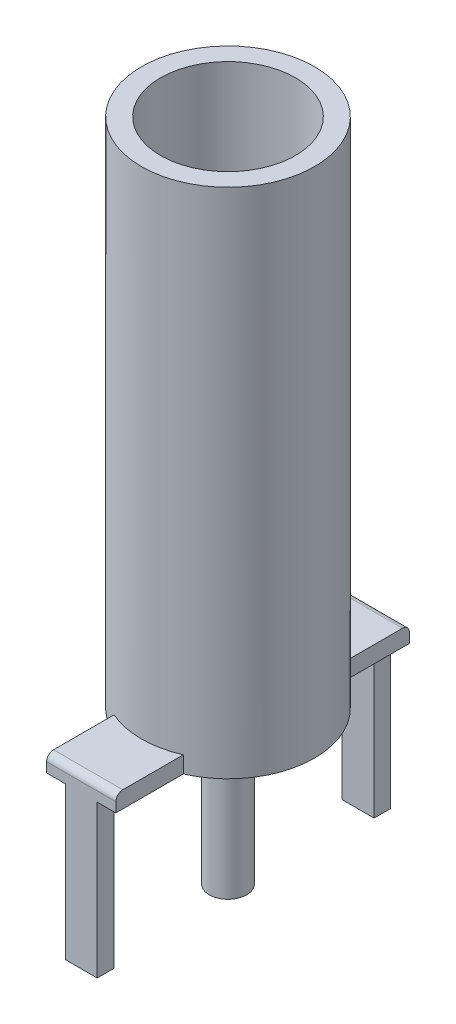
ISO-10303-21;
HEADER;
FILE_DESCRIPTION(('STEP AP214'),'2;1');
FILE_NAME('part.step','',(''),(''),'','','');
FILE_SCHEMA(('AUTOMOTIVE_DESIGN { 1 0 10303 214 1 1 1 1 }'));
ENDSEC;
DATA;
#1=APPLICATION_CONTEXT('core data for automotive mechanical design processes');
#2=APPLICATION_PROTOCOL_DEFINITION('international standard','automotive_design',2000,#1);
#3=PRODUCT_CONTEXT('',#1,'mechanical');
#4=PRODUCT('Part','Part','',(#3));
#5=PRODUCT_RELATED_PRODUCT_CATEGORY('part','',(#4));
#6=PRODUCT_DEFINITION_FORMATION('','',#4);
#7=PRODUCT_DEFINITION_CONTEXT('part definition',#1,'design');
#8=PRODUCT_DEFINITION('design','',#6,#7);
#9=PRODUCT_DEFINITION_SHAPE('','',#8);
#10=(LENGTH_UNIT() NAMED_UNIT(*) SI_UNIT(.MILLI.,.METRE.));
#11=(NAMED_UNIT(*) PLANE_ANGLE_UNIT() SI_UNIT($,.RADIAN.));
#12=(NAMED_UNIT(*) SI_UNIT($,.STERADIAN.) SOLID_ANGLE_UNIT());
#13=UNCERTAINTY_MEASURE_WITH_UNIT(LENGTH_MEASURE(1.E-05),#10,'distance_accuracy_value','');
#14=(GEOMETRIC_REPRESENTATION_CONTEXT(3) GLOBAL_UNCERTAINTY_ASSIGNED_CONTEXT((#13)) GLOBAL_UNIT_ASSIGNED_CONTEXT((#10,
#11,#12)) REPRESENTATION_CONTEXT('',''));
#15=CARTESIAN_POINT('',(0.,0.,0.));
#16=DIRECTION('',(0.,0.,1.));
#17=DIRECTION('',(1.,0.,0.));
#18=AXIS2_PLACEMENT_3D('',#15,#16,#17);
#19=CARTESIAN_POINT('',(0.2921,-2.794,-2.3876));
#20=DIRECTION('',(0.,0.,-1.));
#21=DIRECTION('',(-1.,0.,0.));
#22=AXIS2_PLACEMENT_3D('',#19,#20,#21);
#23=PLANE('',#22);
#24=DIRECTION('',(0.,-1.,0.));
#25=VECTOR('',#24,1.);
#26=CARTESIAN_POINT('',(-0.2921,-1.397,-2.3876));
#27=LINE('',#26,#25);
#28=CARTESIAN_POINT('',(-0.2921,0.,-2.3876));
#29=VERTEX_POINT('',#28);
#30=CARTESIAN_POINT('',(-0.2921,-2.794,-2.3876));
#31=VERTEX_POINT('',#30);
#32=EDGE_CURVE('E295',#29,#31,#27,.T.);
#33=ORIENTED_EDGE('',*,*,#32,.T.);
#34=DIRECTION('',(-1.,0.,0.));
#35=VECTOR('',#34,1.);
#36=CARTESIAN_POINT('',(0.,-2.794,-2.3876));
#37=LINE('',#36,#35);
#38=CARTESIAN_POINT('',(0.2921,-2.794,-2.3876));
#39=VERTEX_POINT('',#38);
#40=EDGE_CURVE('E166',#39,#31,#37,.T.);
#41=ORIENTED_EDGE('',*,*,#40,.F.);
#42=DIRECTION('',(0.,1.,0.));
#43=VECTOR('',#42,1.);
#44=CARTESIAN_POINT('',(0.2921,-1.397,-2.3876));
#45=LINE('',#44,#43);
#46=CARTESIAN_POINT('',(0.2921,0.,-2.3876));
#47=VERTEX_POINT('',#46);
#48=EDGE_CURVE('E159',#39,#47,#45,.T.);
#49=ORIENTED_EDGE('',*,*,#48,.T.);
#50=DIRECTION('',(1.,0.,0.));
#51=VECTOR('',#50,1.);
#52=CARTESIAN_POINT('',(0.,0.,-2.3876));
#53=LINE('',#52,#51);
#54=EDGE_CURVE('E141',#29,#47,#53,.T.);
#55=ORIENTED_EDGE('',*,*,#54,.F.);
#56=EDGE_LOOP('',(#33,#41,#49,#55));
#57=FACE_BOUND('',#56,.T.);
#58=ADVANCED_FACE('F16',(#57),#23,.F.);
#59=CARTESIAN_POINT('',(-0.2921,-2.794,2.3876));
#60=DIRECTION('',(0.,0.,1.));
#61=DIRECTION('',(1.,0.,0.));
#62=AXIS2_PLACEMENT_3D('',#59,#60,#61);
#63=PLANE('',#62);
#64=DIRECTION('',(0.,-1.,0.));
#65=VECTOR('',#64,1.);
#66=CARTESIAN_POINT('',(0.2921,-1.397,2.3876));
#67=LINE('',#66,#65);
#68=CARTESIAN_POINT('',(0.2921,0.,2.3876));
#69=VERTEX_POINT('',#68);
#70=CARTESIAN_POINT('',(0.2921,-2.794,2.3876));
#71=VERTEX_POINT('',#70);
#72=EDGE_CURVE('E268',#69,#71,#67,.T.);
#73=ORIENTED_EDGE('',*,*,#72,.T.);
#74=DIRECTION('',(-1.,0.,0.));
#75=VECTOR('',#74,1.);
#76=CARTESIAN_POINT('',(0.,-2.794,2.3876));
#77=LINE('',#76,#75);
#78=CARTESIAN_POINT('',(-0.2921,-2.794,2.3876));
#79=VERTEX_POINT('',#78);
#80=EDGE_CURVE('E278',#71,#79,#77,.T.);
#81=ORIENTED_EDGE('',*,*,#80,.T.);
#82=DIRECTION('',(0.,1.,0.));
#83=VECTOR('',#82,1.);
#84=CARTESIAN_POINT('',(-0.2921,-1.397,2.3876));
#85=LINE('',#84,#83);
#86=CARTESIAN_POINT('',(-0.2921,0.,2.3876));
#87=VERTEX_POINT('',#86);
#88=EDGE_CURVE('E286',#79,#87,#85,.T.);
#89=ORIENTED_EDGE('',*,*,#88,.T.);
#90=DIRECTION('',(-1.,0.,0.));
#91=VECTOR('',#90,1.);
#92=CARTESIAN_POINT('',(0.,0.,2.3876));
#93=LINE('',#92,#91);
#94=EDGE_CURVE('E154',#69,#87,#93,.T.);
#95=ORIENTED_EDGE('',*,*,#94,.F.);
#96=EDGE_LOOP('',(#73,#81,#89,#95));
#97=FACE_BOUND('',#96,.T.);
#98=ADVANCED_FACE('F418',(#97),#63,.F.);
#99=CARTESIAN_POINT('',(0.2921,-2.794,-2.6924));
#100=DIRECTION('',(-1.,0.,0.));
#101=DIRECTION('',(0.,0.,1.));
#102=AXIS2_PLACEMENT_3D('',#99,#100,#101);
#103=PLANE('',#102);
#104=ORIENTED_EDGE('',*,*,#48,.F.);
#105=DIRECTION('',(0.,0.,1.));
#106=VECTOR('',#105,1.);
#107=CARTESIAN_POINT('',(0.2921,-2.794,-2.54));
#108=LINE('',#107,#106);
#109=CARTESIAN_POINT('',(0.2921,-2.794,-2.6924));
#110=VERTEX_POINT('',#109);
#111=EDGE_CURVE('E163',#110,#39,#108,.T.);
#112=ORIENTED_EDGE('',*,*,#111,.F.);
#113=DIRECTION('',(0.,-1.,0.));
#114=VECTOR('',#113,1.);
#115=CARTESIAN_POINT('',(0.2921,-1.3081,-2.6924));
#116=LINE('',#115,#114);
#117=CARTESIAN_POINT('',(0.292100000048683,-8.4666648692E-11,-2.6924));
#118=VERTEX_POINT('',#117);
#119=EDGE_CURVE('E161',#118,#110,#116,.T.);
#120=ORIENTED_EDGE('',*,*,#119,.F.);
#121=DIRECTION('',(0.,0.,-1.));
#122=VECTOR('',#121,1.);
#123=CARTESIAN_POINT('',(0.2921,0.,-2.54));
#124=LINE('',#123,#122);
#125=EDGE_CURVE('E146',#47,#118,#124,.T.);
#126=ORIENTED_EDGE('',*,*,#125,.F.);
#127=EDGE_LOOP('',(#104,#112,#120,#126));
#128=FACE_BOUND('',#127,.T.);
#129=ADVANCED_FACE('F157',(#128),#103,.F.);
#130=CARTESIAN_POINT('',(-0.2921,-2.794,-2.3876));
#131=DIRECTION('',(0.,-1.,0.));
#132=DIRECTION('',(0.,0.,-1.));
#133=AXIS2_PLACEMENT_3D('',#130,#131,#132);
#134=PLANE('',#133);
#135=ORIENTED_EDGE('',*,*,#111,.T.);
#136=ORIENTED_EDGE('',*,*,#40,.T.);
#137=DIRECTION('',(0.,0.,-1.));
#138=VECTOR('',#137,1.);
#139=CARTESIAN_POINT('',(-0.2921,-2.794,-2.54));
#140=LINE('',#139,#138);
#141=CARTESIAN_POINT('',(-0.2921,-2.794,-2.6924));
#142=VERTEX_POINT('',#141);
#143=EDGE_CURVE('E290',#31,#142,#140,.T.);
#144=ORIENTED_EDGE('',*,*,#143,.T.);
#145=DIRECTION('',(-1.,0.,0.));
#146=VECTOR('',#145,1.);
#147=CARTESIAN_POINT('',(0.,-2.794,-2.6924));
#148=LINE('',#147,#146);
#149=EDGE_CURVE('E246',#110,#142,#148,.T.);
#150=ORIENTED_EDGE('',*,*,#149,.F.);
#151=EDGE_LOOP('',(#135,#136,#144,#150));
#152=FACE_BOUND('',#151,.T.);
#153=ADVANCED_FACE('F330',(#152),#134,.T.);
#154=CARTESIAN_POINT('',(-0.2921,-2.794,-2.3876));
#155=DIRECTION('',(1.,0.,0.));
#156=DIRECTION('',(0.,0.,-1.));
#157=AXIS2_PLACEMENT_3D('',#154,#155,#156);
#158=PLANE('',#157);
#159=DIRECTION('',(0.,1.,0.));
#160=VECTOR('',#159,1.);
#161=CARTESIAN_POINT('',(-0.2921,-1.3081,-2.6924));
#162=LINE('',#161,#160);
#163=CARTESIAN_POINT('',(-0.292100000097367,0.,-2.6924));
#164=VERTEX_POINT('',#163);
#165=EDGE_CURVE('E243',#142,#164,#162,.T.);
#166=ORIENTED_EDGE('',*,*,#165,.F.);
#167=ORIENTED_EDGE('',*,*,#143,.F.);
#168=ORIENTED_EDGE('',*,*,#32,.F.);
#169=DIRECTION('',(0.,0.,1.));
#170=VECTOR('',#169,1.);
#171=CARTESIAN_POINT('',(-0.2921,0.,-2.54));
#172=LINE('',#171,#170);
#173=EDGE_CURVE('E149',#164,#29,#172,.T.);
#174=ORIENTED_EDGE('',*,*,#173,.F.);
#175=EDGE_LOOP('',(#166,#167,#168,#174));
#176=FACE_BOUND('',#175,.T.);
#177=ADVANCED_FACE('F334',(#176),#158,.F.);
#178=CARTESIAN_POINT('',(-0.3470148,-2.794,0.3470148));
#179=DIRECTION('',(0.,-1.,0.));
#180=DIRECTION('',(0.,0.,-1.));
#181=AXIS2_PLACEMENT_3D('',#178,#179,#180);
#182=PLANE('',#181);
#183=CARTESIAN_POINT('',(0.,-2.794,0.));
#184=DIRECTION('',(0.,1.,0.));
#185=DIRECTION('',(0.,0.,1.));
#186=AXIS2_PLACEMENT_3D('',#183,#184,#185);
#187=CIRCLE('',#186,0.3429);
#188=CARTESIAN_POINT('',(0.,-2.794,0.3429));
#189=VERTEX_POINT('',#188);
#190=EDGE_CURVE('E20',#189,#189,#187,.F.);
#191=ORIENTED_EDGE('',*,*,#190,.T.);
#192=EDGE_LOOP('',(#191));
#193=FACE_BOUND('',#192,.T.);
#194=ADVANCED_FACE('F432',(#193),#182,.T.);
#195=CARTESIAN_POINT('',(-0.2921,-2.794,2.6924));
#196=DIRECTION('',(1.,0.,0.));
#197=DIRECTION('',(0.,0.,-1.));
#198=AXIS2_PLACEMENT_3D('',#195,#196,#197);
#199=PLANE('',#198);
#200=ORIENTED_EDGE('',*,*,#88,.F.);
#201=DIRECTION('',(0.,0.,1.));
#202=VECTOR('',#201,1.);
#203=CARTESIAN_POINT('',(-0.2921,-2.794,2.54));
#204=LINE('',#203,#202);
#205=CARTESIAN_POINT('',(-0.2921,-2.794,2.6924));
#206=VERTEX_POINT('',#205);
#207=EDGE_CURVE('E275',#79,#206,#204,.T.);
#208=ORIENTED_EDGE('',*,*,#207,.T.);
#209=DIRECTION('',(0.,-1.,0.));
#210=VECTOR('',#209,1.);
#211=CARTESIAN_POINT('',(-0.2921,-1.3081,2.6924));
#212=LINE('',#211,#210);
#213=CARTESIAN_POINT('',(-0.292100000048683,-8.4666648692E-11,2.6924));
#214=VERTEX_POINT('',#213);
#215=EDGE_CURVE('E272',#214,#206,#212,.T.);
#216=ORIENTED_EDGE('',*,*,#215,.F.);
#217=DIRECTION('',(0.,0.,1.));
#218=VECTOR('',#217,1.);
#219=CARTESIAN_POINT('',(-0.2921,0.,2.54));
#220=LINE('',#219,#218);
#221=EDGE_CURVE('E284',#87,#214,#220,.T.);
#222=ORIENTED_EDGE('',*,*,#221,.F.);
#223=EDGE_LOOP('',(#200,#208,#216,#222));
#224=FACE_BOUND('',#223,.T.);
#225=ADVANCED_FACE('F421',(#224),#199,.F.);
#226=CARTESIAN_POINT('',(-0.2921,-2.794,2.3876));
#227=DIRECTION('',(0.,1.,0.));
#228=DIRECTION('',(0.,0.,1.));
#229=AXIS2_PLACEMENT_3D('',#226,#227,#228);
#230=PLANE('',#229);
#231=ORIENTED_EDGE('',*,*,#80,.F.);
#232=DIRECTION('',(0.,0.,1.));
#233=VECTOR('',#232,1.);
#234=CARTESIAN_POINT('',(0.2921,-2.794,2.54));
#235=LINE('',#234,#233);
#236=CARTESIAN_POINT('',(0.2921,-2.794,2.6924));
#237=VERTEX_POINT('',#236);
#238=EDGE_CURVE('E264',#71,#237,#235,.T.);
#239=ORIENTED_EDGE('',*,*,#238,.T.);
#240=DIRECTION('',(1.,0.,0.));
#241=VECTOR('',#240,1.);
#242=CARTESIAN_POINT('',(0.,-2.794,2.6924));
#243=LINE('',#242,#241);
#244=EDGE_CURVE('E96',#206,#237,#243,.T.);
#245=ORIENTED_EDGE('',*,*,#244,.F.);
#246=ORIENTED_EDGE('',*,*,#207,.F.);
#247=EDGE_LOOP('',(#231,#239,#245,#246));
#248=FACE_BOUND('',#247,.T.);
#249=ADVANCED_FACE('F423',(#248),#230,.F.);
#250=CARTESIAN_POINT('',(0.2921,-2.794,2.3876));
#251=DIRECTION('',(-1.,0.,0.));
#252=DIRECTION('',(0.,0.,1.));
#253=AXIS2_PLACEMENT_3D('',#250,#251,#252);
#254=PLANE('',#253);
#255=DIRECTION('',(0.,1.,0.));
#256=VECTOR('',#255,1.);
#257=CARTESIAN_POINT('',(0.2921,-1.3081,2.6924));
#258=LINE('',#257,#256);
#259=CARTESIAN_POINT('',(0.292100000097367,0.,2.6924));
#260=VERTEX_POINT('',#259);
#261=EDGE_CURVE('E214',#237,#260,#258,.T.);
#262=ORIENTED_EDGE('',*,*,#261,.F.);
#263=ORIENTED_EDGE('',*,*,#238,.F.);
#264=ORIENTED_EDGE('',*,*,#72,.F.);
#265=DIRECTION('',(0.,0.,-1.));
#266=VECTOR('',#265,1.);
#267=CARTESIAN_POINT('',(0.2921,0.,2.54));
#268=LINE('',#267,#266);
#269=EDGE_CURVE('E261',#260,#69,#268,.T.);
#270=ORIENTED_EDGE('',*,*,#269,.F.);
#271=EDGE_LOOP('',(#262,#263,#264,#270));
#272=FACE_BOUND('',#271,.T.);
#273=ADVANCED_FACE('F415',(#272),#254,.F.);
#274=CARTESIAN_POINT('',(0.635,0.1778,-2.5654));
#275=DIRECTION('',(-1.,0.,0.));
#276=DIRECTION('',(0.,0.,1.));
#277=AXIS2_PLACEMENT_3D('',#274,#275,#276);
#278=CYLINDRICAL_SURFACE('',#277,0.126999999999999);
#279=DIRECTION('',(1.,0.,0.));
#280=VECTOR('',#279,1.);
#281=CARTESIAN_POINT('',(0.,0.3048,-2.5654));
#282=LINE('',#281,#280);
#283=CARTESIAN_POINT('',(-0.635,0.3048,-2.5654));
#284=VERTEX_POINT('',#283);
#285=CARTESIAN_POINT('',(0.635,0.3048,-2.5654));
#286=VERTEX_POINT('',#285);
#287=EDGE_CURVE('E255',#284,#286,#282,.T.);
#288=ORIENTED_EDGE('',*,*,#287,.T.);
#289=CARTESIAN_POINT('',(0.635,0.1778,-2.5654));
#290=DIRECTION('',(-1.,0.,0.));
#291=DIRECTION('',(0.,0.,1.));
#292=AXIS2_PLACEMENT_3D('',#289,#290,#291);
#293=CIRCLE('',#292,0.126999999999999);
#294=CARTESIAN_POINT('',(0.635,0.1778,-2.6924));
#295=VERTEX_POINT('',#294);
#296=EDGE_CURVE('E202',#295,#286,#293,.F.);
#297=ORIENTED_EDGE('',*,*,#296,.F.);
#298=DIRECTION('',(1.,0.,0.));
#299=VECTOR('',#298,1.);
#300=CARTESIAN_POINT('',(0.,0.1778,-2.6924));
#301=LINE('',#300,#299);
#302=CARTESIAN_POINT('',(-0.635,0.1778,-2.6924));
#303=VERTEX_POINT('',#302);
#304=EDGE_CURVE('E259',#303,#295,#301,.T.);
#305=ORIENTED_EDGE('',*,*,#304,.F.);
#306=CARTESIAN_POINT('',(-0.635,0.1778,-2.5654));
#307=DIRECTION('',(-1.,0.,0.));
#308=DIRECTION('',(0.,0.,1.));
#309=AXIS2_PLACEMENT_3D('',#306,#307,#308);
#310=CIRCLE('',#309,0.126999999999999);
#311=EDGE_CURVE('E206',#284,#303,#310,.T.);
#312=ORIENTED_EDGE('',*,*,#311,.F.);
#313=EDGE_LOOP('',(#288,#297,#305,#312));
#314=FACE_BOUND('',#313,.T.);
#315=ADVANCED_FACE('F374',(#314),#278,.T.);
#316=CARTESIAN_POINT('',(0.635,-2.794,-2.6924));
#317=DIRECTION('',(0.,0.,-1.));
#318=DIRECTION('',(-1.,0.,0.));
#319=AXIS2_PLACEMENT_3D('',#316,#317,#318);
#320=PLANE('',#319);
#321=ORIENTED_EDGE('',*,*,#165,.T.);
#322=DIRECTION('',(-1.,0.,0.));
#323=VECTOR('',#322,1.);
#324=CARTESIAN_POINT('',(0.,0.,-2.6924));
#325=LINE('',#324,#323);
#326=CARTESIAN_POINT('',(-0.6349999991999,0.,-2.6924));
#327=VERTEX_POINT('',#326);
#328=EDGE_CURVE('E236',#164,#327,#325,.T.);
#329=ORIENTED_EDGE('',*,*,#328,.T.);
#330=DIRECTION('',(0.,-1.,0.));
#331=VECTOR('',#330,1.);
#332=CARTESIAN_POINT('',(-0.635,0.1524,-2.6924));
#333=LINE('',#332,#331);
#334=EDGE_CURVE('E207',#303,#327,#333,.T.);
#335=ORIENTED_EDGE('',*,*,#334,.F.);
#336=ORIENTED_EDGE('',*,*,#304,.T.);
#337=DIRECTION('',(0.,1.,0.));
#338=VECTOR('',#337,1.);
#339=CARTESIAN_POINT('',(0.635,0.1524,-2.6924));
#340=LINE('',#339,#338);
#341=CARTESIAN_POINT('',(0.634999999199901,0.,-2.6924));
#342=VERTEX_POINT('',#341);
#343=EDGE_CURVE('E205',#342,#295,#340,.T.);
#344=ORIENTED_EDGE('',*,*,#343,.F.);
#345=DIRECTION('',(-1.,0.,0.));
#346=VECTOR('',#345,1.);
#347=CARTESIAN_POINT('',(0.,0.,-2.6924));
#348=LINE('',#347,#346);
#349=EDGE_CURVE('E240',#342,#118,#348,.T.);
#350=ORIENTED_EDGE('',*,*,#349,.T.);
#351=ORIENTED_EDGE('',*,*,#119,.T.);
#352=ORIENTED_EDGE('',*,*,#149,.T.);
#353=EDGE_LOOP('',(#321,#329,#335,#336,#344,#350,#351,#352));
#354=FACE_BOUND('',#353,.T.);
#355=ADVANCED_FACE('F336',(#354),#320,.T.);
#356=CARTESIAN_POINT('',(0.,-2.794,0.));
#357=DIRECTION('',(0.,1.,0.));
#358=DIRECTION('',(0.,0.,1.));
#359=AXIS2_PLACEMENT_3D('',#356,#357,#358);
#360=CYLINDRICAL_SURFACE('',#359,0.3429);
#361=ORIENTED_EDGE('',*,*,#190,.F.);
#362=EDGE_LOOP('',(#361));
#363=FACE_BOUND('',#362,.T.);
#364=CARTESIAN_POINT('',(0.,0.,0.));
#365=DIRECTION('',(0.,1.,0.));
#366=DIRECTION('',(0.,0.,1.));
#367=AXIS2_PLACEMENT_3D('',#364,#365,#366);
#368=CIRCLE('',#367,0.3429);
#369=CARTESIAN_POINT('',(0.,0.,0.3429));
#370=VERTEX_POINT('',#369);
#371=EDGE_CURVE('E198',#370,#370,#368,.F.);
#372=ORIENTED_EDGE('',*,*,#371,.T.);
#373=EDGE_LOOP('',(#372));
#374=FACE_BOUND('',#373,.T.);
#375=ADVANCED_FACE('F452',(#363,#374),#360,.T.);
#376=CARTESIAN_POINT('',(-0.635,-2.794,2.6924));
#377=DIRECTION('',(0.,0.,1.));
#378=DIRECTION('',(1.,0.,0.));
#379=AXIS2_PLACEMENT_3D('',#376,#377,#378);
#380=PLANE('',#379);
#381=ORIENTED_EDGE('',*,*,#261,.T.);
#382=DIRECTION('',(1.,0.,0.));
#383=VECTOR('',#382,1.);
#384=CARTESIAN_POINT('',(0.,0.,2.6924));
#385=LINE('',#384,#383);
#386=CARTESIAN_POINT('',(0.635,0.,2.6924));
#387=VERTEX_POINT('',#386);
#388=EDGE_CURVE('E225',#260,#387,#385,.T.);
#389=ORIENTED_EDGE('',*,*,#388,.T.);
#390=DIRECTION('',(0.,-1.,0.));
#391=VECTOR('',#390,1.);
#392=CARTESIAN_POINT('',(0.635,0.1524,2.6924));
#393=LINE('',#392,#391);
#394=CARTESIAN_POINT('',(0.635,0.177799999973952,2.6924));
#395=VERTEX_POINT('',#394);
#396=EDGE_CURVE('E197',#395,#387,#393,.T.);
#397=ORIENTED_EDGE('',*,*,#396,.F.);
#398=DIRECTION('',(1.,0.,0.));
#399=VECTOR('',#398,1.);
#400=CARTESIAN_POINT('',(0.,0.177799999947904,2.6924));
#401=LINE('',#400,#399);
#402=CARTESIAN_POINT('',(-0.635,0.177799999973952,2.6924));
#403=VERTEX_POINT('',#402);
#404=EDGE_CURVE('E212',#395,#403,#401,.F.);
#405=ORIENTED_EDGE('',*,*,#404,.T.);
#406=DIRECTION('',(0.,1.,0.));
#407=VECTOR('',#406,1.);
#408=CARTESIAN_POINT('',(-0.635,0.1524,2.6924));
#409=LINE('',#408,#407);
#410=CARTESIAN_POINT('',(-0.6349999991999,0.,2.6924));
#411=VERTEX_POINT('',#410);
#412=EDGE_CURVE('E87',#411,#403,#409,.T.);
#413=ORIENTED_EDGE('',*,*,#412,.F.);
#414=DIRECTION('',(1.,0.,0.));
#415=VECTOR('',#414,1.);
#416=CARTESIAN_POINT('',(0.,0.,2.6924));
#417=LINE('',#416,#415);
#418=EDGE_CURVE('E201',#411,#214,#417,.T.);
#419=ORIENTED_EDGE('',*,*,#418,.T.);
#420=ORIENTED_EDGE('',*,*,#215,.T.);
#421=ORIENTED_EDGE('',*,*,#244,.T.);
#422=EDGE_LOOP('',(#381,#389,#397,#405,#413,#419,#420,#421));
#423=FACE_BOUND('',#422,.T.);
#424=ADVANCED_FACE('F393',(#423),#380,.T.);
#425=CARTESIAN_POINT('',(-0.635,0.1778,2.5654));
#426=DIRECTION('',(1.,0.,0.));
#427=DIRECTION('',(0.,0.,-1.));
#428=AXIS2_PLACEMENT_3D('',#425,#426,#427);
#429=CYLINDRICAL_SURFACE('',#428,0.126999999999999);
#430=DIRECTION('',(-1.,0.,0.));
#431=VECTOR('',#430,1.);
#432=CARTESIAN_POINT('',(0.,0.3048,2.5654));
#433=LINE('',#432,#431);
#434=CARTESIAN_POINT('',(0.635,0.3048,2.5654));
#435=VERTEX_POINT('',#434);
#436=CARTESIAN_POINT('',(-0.635,0.3048,2.5654));
#437=VERTEX_POINT('',#436);
#438=EDGE_CURVE('E221',#435,#437,#433,.T.);
#439=ORIENTED_EDGE('',*,*,#438,.T.);
#440=CARTESIAN_POINT('',(-0.635,0.1778,2.5654));
#441=DIRECTION('',(1.,0.,0.));
#442=DIRECTION('',(0.,0.,-1.));
#443=AXIS2_PLACEMENT_3D('',#440,#441,#442);
#444=CIRCLE('',#443,0.126999999999999);
#445=EDGE_CURVE('E208',#403,#437,#444,.F.);
#446=ORIENTED_EDGE('',*,*,#445,.F.);
#447=ORIENTED_EDGE('',*,*,#404,.F.);
#448=CARTESIAN_POINT('',(0.635,0.1778,2.5654));
#449=DIRECTION('',(1.,0.,0.));
#450=DIRECTION('',(0.,0.,-1.));
#451=AXIS2_PLACEMENT_3D('',#448,#449,#450);
#452=CIRCLE('',#451,0.126999999999999);
#453=EDGE_CURVE('E194',#435,#395,#452,.T.);
#454=ORIENTED_EDGE('',*,*,#453,.F.);
#455=EDGE_LOOP('',(#439,#446,#447,#454));
#456=FACE_BOUND('',#455,.T.);
#457=ADVANCED_FACE('F448',(#456),#429,.T.);
#458=CARTESIAN_POINT('',(-0.635,0.,1.4549677784));
#459=DIRECTION('',(-1.,0.,0.));
#460=DIRECTION('',(0.,0.,1.));
#461=AXIS2_PLACEMENT_3D('',#458,#459,#460);
#462=PLANE('',#461);
#463=DIRECTION('',(0.,1.,0.));
#464=VECTOR('',#463,1.);
#465=CARTESIAN_POINT('',(-0.635000000498645,4.699,1.45496778293085));
#466=LINE('',#465,#464);
#467=CARTESIAN_POINT('',(-0.635000000124661,0.304799997968001,1.45496778303967));
#468=VERTEX_POINT('',#467);
#469=CARTESIAN_POINT('',(-0.634999999449223,0.,1.45496778338886));
#470=VERTEX_POINT('',#469);
#471=EDGE_CURVE('E193',#468,#470,#466,.F.);
#472=ORIENTED_EDGE('',*,*,#471,.T.);
#473=DIRECTION('',(0.,0.,1.));
#474=VECTOR('',#473,1.);
#475=CARTESIAN_POINT('',(-0.6349999983998,0.,0.));
#476=LINE('',#475,#474);
#477=EDGE_CURVE('E233',#470,#411,#476,.T.);
#478=ORIENTED_EDGE('',*,*,#477,.T.);
#479=ORIENTED_EDGE('',*,*,#412,.T.);
#480=ORIENTED_EDGE('',*,*,#445,.T.);
#481=DIRECTION('',(0.,0.,-1.));
#482=VECTOR('',#481,1.);
#483=CARTESIAN_POINT('',(-0.635,0.3048,2.0068525903));
#484=LINE('',#483,#482);
#485=EDGE_CURVE('E224',#437,#468,#484,.T.);
#486=ORIENTED_EDGE('',*,*,#485,.T.);
#487=EDGE_LOOP('',(#472,#478,#479,#480,#486));
#488=FACE_BOUND('',#487,.T.);
#489=ADVANCED_FACE('F398',(#488),#462,.T.);
#490=CARTESIAN_POINT('',(-0.635,0.,-2.6924));
#491=DIRECTION('',(-1.,0.,0.));
#492=DIRECTION('',(0.,0.,1.));
#493=AXIS2_PLACEMENT_3D('',#490,#491,#492);
#494=PLANE('',#493);
#495=DIRECTION('',(0.,0.,1.));
#496=VECTOR('',#495,1.);
#497=CARTESIAN_POINT('',(-0.6349999983998,0.,0.));
#498=LINE('',#497,#496);
#499=CARTESIAN_POINT('',(-0.634999999281449,0.,-1.45496778346208));
#500=VERTEX_POINT('',#499);
#501=EDGE_CURVE('E239',#327,#500,#498,.T.);
#502=ORIENTED_EDGE('',*,*,#501,.T.);
#503=DIRECTION('',(0.,-1.,0.));
#504=VECTOR('',#503,1.);
#505=CARTESIAN_POINT('',(-0.635000000163098,4.699,-1.4549677830773));
#506=LINE('',#505,#504);
#507=CARTESIAN_POINT('',(-0.635000000040775,0.304799997968001,-1.45496778311289));
#508=VERTEX_POINT('',#507);
#509=EDGE_CURVE('E189',#500,#508,#506,.F.);
#510=ORIENTED_EDGE('',*,*,#509,.T.);
#511=DIRECTION('',(0.,0.,-1.));
#512=VECTOR('',#511,1.);
#513=CARTESIAN_POINT('',(-0.635,0.3048,-2.0068525903));
#514=LINE('',#513,#512);
#515=EDGE_CURVE('E258',#508,#284,#514,.T.);
#516=ORIENTED_EDGE('',*,*,#515,.T.);
#517=ORIENTED_EDGE('',*,*,#311,.T.);
#518=ORIENTED_EDGE('',*,*,#334,.T.);
#519=EDGE_LOOP('',(#502,#510,#516,#517,#518));
#520=FACE_BOUND('',#519,.T.);
#521=ADVANCED_FACE('F367',(#520),#494,.T.);
#522=CARTESIAN_POINT('',(-0.635,0.3048,-1.4483051806));
#523=DIRECTION('',(0.,-1.,0.));
#524=DIRECTION('',(0.,0.,-1.));
#525=AXIS2_PLACEMENT_3D('',#522,#523,#524);
#526=PLANE('',#525);
#527=ORIENTED_EDGE('',*,*,#287,.F.);
#528=ORIENTED_EDGE('',*,*,#515,.F.);
#529=CARTESIAN_POINT('',(0.,0.304799995936002,0.));
#530=DIRECTION('',(0.,-1.,0.));
#531=DIRECTION('',(0.,0.,-1.));
#532=AXIS2_PLACEMENT_3D('',#529,#530,#531);
#533=CIRCLE('',#532,1.5875);
#534=CARTESIAN_POINT('',(0.634999999975452,0.304799997968001,-1.45496778316991));
#535=VERTEX_POINT('',#534);
#536=EDGE_CURVE('E186',#508,#535,#533,.T.);
#537=ORIENTED_EDGE('',*,*,#536,.T.);
#538=DIRECTION('',(0.,0.,1.));
#539=VECTOR('',#538,1.);
#540=CARTESIAN_POINT('',(0.635,0.3048,-2.0736838892));
#541=LINE('',#540,#539);
#542=EDGE_CURVE('E204',#286,#535,#541,.T.);
#543=ORIENTED_EDGE('',*,*,#542,.F.);
#544=EDGE_LOOP('',(#527,#528,#537,#543));
#545=FACE_BOUND('',#544,.T.);
#546=ADVANCED_FACE('F379',(#545),#526,.F.);
#547=CARTESIAN_POINT('',(0.635,0.,-1.4549677784));
#548=DIRECTION('',(1.,0.,0.));
#549=DIRECTION('',(0.,0.,-1.));
#550=AXIS2_PLACEMENT_3D('',#547,#548,#549);
#551=PLANE('',#550);
#552=DIRECTION('',(0.,1.,0.));
#553=VECTOR('',#552,1.);
#554=CARTESIAN_POINT('',(0.634999999901807,4.699,-1.45496778319133));
#555=LINE('',#554,#553);
#556=CARTESIAN_POINT('',(0.634999999150804,0.,-1.4549677835191));
#557=VERTEX_POINT('',#556);
#558=EDGE_CURVE('E185',#535,#557,#555,.F.);
#559=ORIENTED_EDGE('',*,*,#558,.T.);
#560=DIRECTION('',(0.,0.,-1.));
#561=VECTOR('',#560,1.);
#562=CARTESIAN_POINT('',(0.634999998399801,0.,0.));
#563=LINE('',#562,#561);
#564=EDGE_CURVE('E228',#557,#342,#563,.T.);
#565=ORIENTED_EDGE('',*,*,#564,.T.);
#566=ORIENTED_EDGE('',*,*,#343,.T.);
#567=ORIENTED_EDGE('',*,*,#296,.T.);
#568=ORIENTED_EDGE('',*,*,#542,.T.);
#569=EDGE_LOOP('',(#559,#565,#566,#567,#568));
#570=FACE_BOUND('',#569,.T.);
#571=ADVANCED_FACE('F373',(#570),#551,.T.);
#572=CARTESIAN_POINT('',(-1.60655,0.,-2.6924));
#573=DIRECTION('',(0.,1.,0.));
#574=DIRECTION('',(0.,0.,1.));
#575=AXIS2_PLACEMENT_3D('',#572,#573,#574);
#576=PLANE('',#575);
#577=ORIENTED_EDGE('',*,*,#371,.F.);
#578=EDGE_LOOP('',(#577));
#579=FACE_BOUND('',#578,.T.);
#580=ORIENTED_EDGE('',*,*,#418,.F.);
#581=ORIENTED_EDGE('',*,*,#477,.F.);
#582=CARTESIAN_POINT('',(0.,0.,0.));
#583=DIRECTION('',(0.,-1.,0.));
#584=DIRECTION('',(0.,0.,-1.));
#585=AXIS2_PLACEMENT_3D('',#582,#583,#584);
#586=CIRCLE('',#585,1.5875);
#587=EDGE_CURVE('E190',#470,#500,#586,.T.);
#588=ORIENTED_EDGE('',*,*,#587,.T.);
#589=ORIENTED_EDGE('',*,*,#501,.F.);
#590=ORIENTED_EDGE('',*,*,#328,.F.);
#591=ORIENTED_EDGE('',*,*,#173,.T.);
#592=ORIENTED_EDGE('',*,*,#54,.T.);
#593=ORIENTED_EDGE('',*,*,#125,.T.);
#594=ORIENTED_EDGE('',*,*,#349,.F.);
#595=ORIENTED_EDGE('',*,*,#564,.F.);
#596=CARTESIAN_POINT('',(0.,0.,0.));
#597=DIRECTION('',(0.,-1.,0.));
#598=DIRECTION('',(0.,0.,-1.));
#599=AXIS2_PLACEMENT_3D('',#596,#597,#598);
#600=CIRCLE('',#599,1.5875);
#601=CARTESIAN_POINT('',(0.634999999652485,0.,1.45496778330015));
#602=VERTEX_POINT('',#601);
#603=EDGE_CURVE('E182',#557,#602,#600,.T.);
#604=ORIENTED_EDGE('',*,*,#603,.T.);
#605=DIRECTION('',(0.,0.,-1.));
#606=VECTOR('',#605,1.);
#607=CARTESIAN_POINT('',(0.635,0.,2.0736838892));
#608=LINE('',#607,#606);
#609=EDGE_CURVE('E389',#387,#602,#608,.T.);
#610=ORIENTED_EDGE('',*,*,#609,.F.);
#611=ORIENTED_EDGE('',*,*,#388,.F.);
#612=ORIENTED_EDGE('',*,*,#269,.T.);
#613=ORIENTED_EDGE('',*,*,#94,.T.);
#614=ORIENTED_EDGE('',*,*,#221,.T.);
#615=EDGE_LOOP('',(#580,#581,#588,#589,#590,#591,#592,#593,#594,#595,#604,#610,#611,#612,#613,#614));
#616=FACE_BOUND('',#615,.T.);
#617=ADVANCED_FACE('F144',(#579,#616),#576,.F.);
#618=CARTESIAN_POINT('',(0.635,0.,2.6924));
#619=DIRECTION('',(1.,0.,0.));
#620=DIRECTION('',(0.,0.,-1.));
#621=AXIS2_PLACEMENT_3D('',#618,#619,#620);
#622=PLANE('',#621);
#623=ORIENTED_EDGE('',*,*,#609,.T.);
#624=DIRECTION('',(0.,-1.,0.));
#625=VECTOR('',#624,1.);
#626=CARTESIAN_POINT('',(0.63499999930497,4.699,1.45496778345182));
#627=LINE('',#626,#625);
#628=CARTESIAN_POINT('',(0.634999999826243,0.304799997968001,1.45496778330015));
#629=VERTEX_POINT('',#628);
#630=EDGE_CURVE('E181',#602,#629,#627,.F.);
#631=ORIENTED_EDGE('',*,*,#630,.T.);
#632=DIRECTION('',(0.,0.,1.));
#633=VECTOR('',#632,1.);
#634=CARTESIAN_POINT('',(0.635,0.3048,2.0068525903));
#635=LINE('',#634,#633);
#636=EDGE_CURVE('E35',#629,#435,#635,.T.);
#637=ORIENTED_EDGE('',*,*,#636,.T.);
#638=ORIENTED_EDGE('',*,*,#453,.T.);
#639=ORIENTED_EDGE('',*,*,#396,.T.);
#640=EDGE_LOOP('',(#623,#631,#637,#638,#639));
#641=FACE_BOUND('',#640,.T.);
#642=ADVANCED_FACE('F411',(#641),#622,.T.);
#643=CARTESIAN_POINT('',(-0.635,0.3048,2.5654));
#644=DIRECTION('',(0.,-1.,0.));
#645=DIRECTION('',(0.,0.,-1.));
#646=AXIS2_PLACEMENT_3D('',#643,#644,#645);
#647=PLANE('',#646);
#648=ORIENTED_EDGE('',*,*,#438,.F.);
#649=ORIENTED_EDGE('',*,*,#636,.F.);
#650=CARTESIAN_POINT('',(0.,0.304799995936002,0.));
#651=DIRECTION('',(0.,-1.,0.));
#652=DIRECTION('',(0.,0.,-1.));
#653=AXIS2_PLACEMENT_3D('',#650,#651,#652);
#654=CIRCLE('',#653,1.5875);
#655=EDGE_CURVE('E179',#629,#468,#654,.T.);
#656=ORIENTED_EDGE('',*,*,#655,.T.);
#657=ORIENTED_EDGE('',*,*,#485,.F.);
#658=EDGE_LOOP('',(#648,#649,#656,#657));
#659=FACE_BOUND('',#658,.T.);
#660=ADVANCED_FACE('F447',(#659),#647,.F.);
#661=CARTESIAN_POINT('',(0.,9.398,0.));
#662=DIRECTION('',(0.,-1.,0.));
#663=DIRECTION('',(0.,0.,-1.));
#664=AXIS2_PLACEMENT_3D('',#661,#662,#663);
#665=CYLINDRICAL_SURFACE('',#664,1.5875);
#666=ORIENTED_EDGE('',*,*,#536,.F.);
#667=ORIENTED_EDGE('',*,*,#509,.F.);
#668=ORIENTED_EDGE('',*,*,#587,.F.);
#669=ORIENTED_EDGE('',*,*,#471,.F.);
#670=ORIENTED_EDGE('',*,*,#655,.F.);
#671=ORIENTED_EDGE('',*,*,#630,.F.);
#672=ORIENTED_EDGE('',*,*,#603,.F.);
#673=ORIENTED_EDGE('',*,*,#558,.F.);
#674=EDGE_LOOP('',(#666,#667,#668,#669,#670,#671,#672,#673));
#675=FACE_BOUND('',#674,.T.);
#676=CARTESIAN_POINT('',(0.,9.398,0.));
#677=DIRECTION('',(0.,-1.,0.));
#678=DIRECTION('',(0.,0.,-1.));
#679=AXIS2_PLACEMENT_3D('',#676,#677,#678);
#680=CIRCLE('',#679,1.5875);
#681=CARTESIAN_POINT('',(0.,9.398,-1.5875));
#682=VERTEX_POINT('',#681);
#683=EDGE_CURVE('E176',#682,#682,#680,.F.);
#684=ORIENTED_EDGE('',*,*,#683,.F.);
#685=EDGE_LOOP('',(#684));
#686=FACE_BOUND('',#685,.T.);
#687=ADVANCED_FACE('F383',(#675,#686),#665,.T.);
#688=CARTESIAN_POINT('',(-1.2519284842,1.524,-1.2519284842));
#689=DIRECTION('',(0.,1.,0.));
#690=DIRECTION('',(0.,0.,1.));
#691=AXIS2_PLACEMENT_3D('',#688,#689,#690);
#692=PLANE('',#691);
#693=CARTESIAN_POINT('',(0.,1.524,0.));
#694=DIRECTION('',(0.,1.,0.));
#695=DIRECTION('',(-1.,0.,0.));
#696=AXIS2_PLACEMENT_3D('',#693,#694,#695);
#697=CIRCLE('',#696,1.2370834796);
#698=CARTESIAN_POINT('',(-1.2370834796,1.524,0.));
#699=VERTEX_POINT('',#698);
#700=EDGE_CURVE('E26',#699,#699,#697,.F.);
#701=ORIENTED_EDGE('',*,*,#700,.F.);
#702=EDGE_LOOP('',(#701));
#703=FACE_BOUND('',#702,.T.);
#704=ADVANCED_FACE('F441',(#703),#692,.T.);
#705=CARTESIAN_POINT('',(-1.60655,9.398,-1.60655));
#706=DIRECTION('',(0.,1.,0.));
#707=DIRECTION('',(0.,0.,1.));
#708=AXIS2_PLACEMENT_3D('',#705,#706,#707);
#709=PLANE('',#708);
#710=CARTESIAN_POINT('',(0.,9.398,0.));
#711=DIRECTION('',(0.,1.,0.));
#712=DIRECTION('',(-1.,0.,0.));
#713=AXIS2_PLACEMENT_3D('',#710,#711,#712);
#714=CIRCLE('',#713,1.2370834796);
#715=CARTESIAN_POINT('',(-1.2370834796,9.398,0.));
#716=VERTEX_POINT('',#715);
#717=EDGE_CURVE('E11',#716,#716,#714,.T.);
#718=ORIENTED_EDGE('',*,*,#717,.F.);
#719=EDGE_LOOP('',(#718));
#720=FACE_BOUND('',#719,.T.);
#721=ORIENTED_EDGE('',*,*,#683,.T.);
#722=EDGE_LOOP('',(#721));
#723=FACE_BOUND('',#722,.T.);
#724=ADVANCED_FACE('F18',(#720,#723),#709,.T.);
#725=CARTESIAN_POINT('',(0.,1.524,0.));
#726=DIRECTION('',(0.,1.,0.));
#727=DIRECTION('',(-1.,0.,0.));
#728=AXIS2_PLACEMENT_3D('',#725,#726,#727);
#729=CYLINDRICAL_SURFACE('',#728,1.2370834796);
#730=ORIENTED_EDGE('',*,*,#717,.T.);
#731=EDGE_LOOP('',(#730));
#732=FACE_BOUND('',#731,.T.);
#733=ORIENTED_EDGE('',*,*,#700,.T.);
#734=EDGE_LOOP('',(#733));
#735=FACE_BOUND('',#734,.T.);
#736=ADVANCED_FACE('F434',(#732,#735),#729,.F.);
#737=CLOSED_SHELL('',(#58,#98,#129,#153,#177,#194,#225,#249,#273,#315,#355,#375,#424,#457,#489,
#521,#546,#571,#617,#642,#660,#687,#704,#724,#736));
#738=MANIFOLD_SOLID_BREP('B1',#737);
#739=ADVANCED_BREP_SHAPE_REPRESENTATION('',(#18,#738),#14);
#740=SHAPE_DEFINITION_REPRESENTATION(#9,#739);
ENDSEC;
END-ISO-10303-21;
